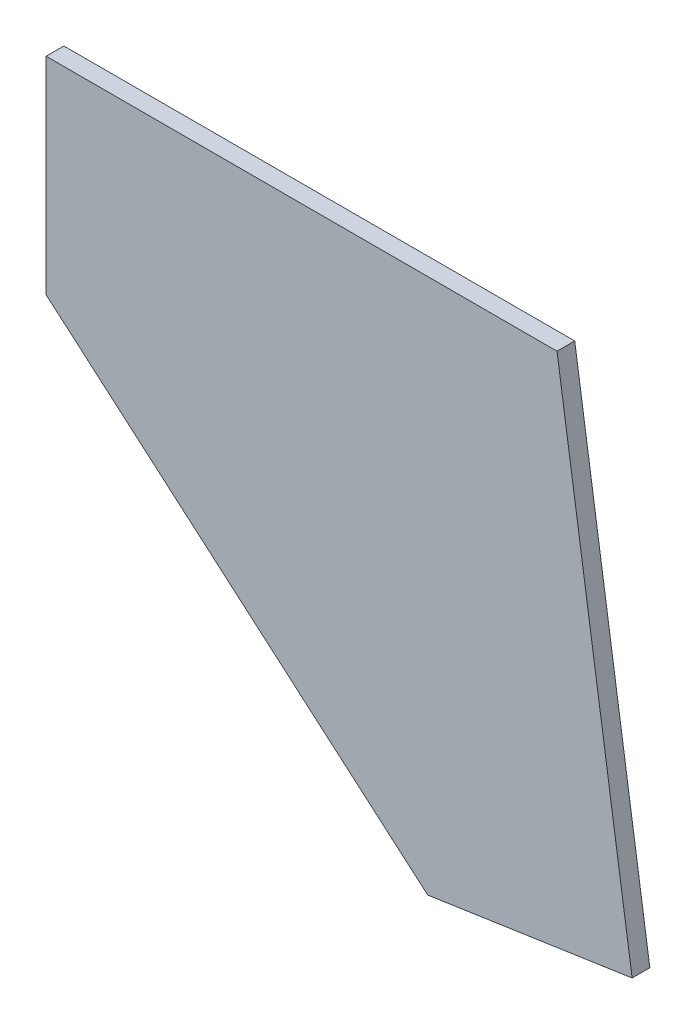
ISO-10303-21;
HEADER;
FILE_DESCRIPTION(('STEP AP214'),'2;1');
FILE_NAME('part.step','',(''),(''),'','','');
FILE_SCHEMA(('AUTOMOTIVE_DESIGN { 1 0 10303 214 1 1 1 1 }'));
ENDSEC;
DATA;
#1=APPLICATION_CONTEXT('core data for automotive mechanical design processes');
#2=APPLICATION_PROTOCOL_DEFINITION('international standard','automotive_design',2000,#1);
#3=PRODUCT_CONTEXT('',#1,'mechanical');
#4=PRODUCT('Part','Part','',(#3));
#5=PRODUCT_RELATED_PRODUCT_CATEGORY('part','',(#4));
#6=PRODUCT_DEFINITION_FORMATION('','',#4);
#7=PRODUCT_DEFINITION_CONTEXT('part definition',#1,'design');
#8=PRODUCT_DEFINITION('design','',#6,#7);
#9=PRODUCT_DEFINITION_SHAPE('','',#8);
#10=(LENGTH_UNIT() NAMED_UNIT(*) SI_UNIT(.MILLI.,.METRE.));
#11=(NAMED_UNIT(*) PLANE_ANGLE_UNIT() SI_UNIT($,.RADIAN.));
#12=(NAMED_UNIT(*) SI_UNIT($,.STERADIAN.) SOLID_ANGLE_UNIT());
#13=UNCERTAINTY_MEASURE_WITH_UNIT(LENGTH_MEASURE(1.E-05),#10,'distance_accuracy_value','');
#14=(GEOMETRIC_REPRESENTATION_CONTEXT(3) GLOBAL_UNCERTAINTY_ASSIGNED_CONTEXT((#13)) GLOBAL_UNIT_ASSIGNED_CONTEXT((#10,
#11,#12)) REPRESENTATION_CONTEXT('',''));
#15=CARTESIAN_POINT('',(0.,0.,0.));
#16=DIRECTION('',(0.,0.,1.));
#17=DIRECTION('',(1.,0.,0.));
#18=AXIS2_PLACEMENT_3D('',#15,#16,#17);
#19=CARTESIAN_POINT('',(-17.6726500668737,-221.169430364682,-6.));
#20=DIRECTION('',(0.989131438478668,0.147034000874357,0.));
#21=DIRECTION('',(-0.147034000874357,0.989131438478668,0.));
#22=AXIS2_PLACEMENT_3D('',#19,#20,#21);
#23=PLANE('',#22);
#24=DIRECTION('',(-0.147034000874357,0.989131438478668,0.));
#25=VECTOR('',#24,1.);
#26=CARTESIAN_POINT('',(-17.6726500668737,-221.169430364682,0.));
#27=LINE('',#26,#25);
#28=CARTESIAN_POINT('',(-17.6726500668737,-221.169430364682,0.));
#29=VERTEX_POINT('',#28);
#30=CARTESIAN_POINT('',(-43.1169188413177,-50.0000000000005,0.));
#31=VERTEX_POINT('',#30);
#32=EDGE_CURVE('E113',#29,#31,#27,.T.);
#33=ORIENTED_EDGE('',*,*,#32,.F.);
#34=DIRECTION('',(0.,0.,1.));
#35=VECTOR('',#34,1.);
#36=CARTESIAN_POINT('',(-17.6726500668737,-221.169430364682,-6.));
#37=LINE('',#36,#35);
#38=CARTESIAN_POINT('',(-17.6726500668737,-221.169430364682,-6.));
#39=VERTEX_POINT('',#38);
#40=EDGE_CURVE('E11',#39,#29,#37,.T.);
#41=ORIENTED_EDGE('',*,*,#40,.F.);
#42=DIRECTION('',(-0.147034000874357,0.989131438478668,0.));
#43=VECTOR('',#42,1.);
#44=CARTESIAN_POINT('',(-17.6726500668737,-221.169430364682,-6.));
#45=LINE('',#44,#43);
#46=CARTESIAN_POINT('',(-43.1169188413177,-50.0000000000005,-6.));
#47=VERTEX_POINT('',#46);
#48=EDGE_CURVE('E108',#39,#47,#45,.T.);
#49=ORIENTED_EDGE('',*,*,#48,.T.);
#50=DIRECTION('',(0.,0.,1.));
#51=VECTOR('',#50,1.);
#52=CARTESIAN_POINT('',(-43.1169188413177,-50.0000000000005,-6.));
#53=LINE('',#52,#51);
#54=EDGE_CURVE('E39',#47,#31,#53,.T.);
#55=ORIENTED_EDGE('',*,*,#54,.T.);
#56=EDGE_LOOP('',(#33,#41,#49,#55));
#57=FACE_BOUND('',#56,.T.);
#58=ADVANCED_FACE('F36',(#57),#23,.T.);
#59=CARTESIAN_POINT('',(-86.9118507603805,-231.461810425887,-6.));
#60=DIRECTION('',(0.147034000874357,-0.989131438478668,0.));
#61=DIRECTION('',(0.989131438478668,0.147034000874357,0.));
#62=AXIS2_PLACEMENT_3D('',#59,#60,#61);
#63=PLANE('',#62);
#64=DIRECTION('',(0.989131438478668,0.147034000874357,0.));
#65=VECTOR('',#64,1.);
#66=CARTESIAN_POINT('',(-86.9118507603805,-231.461810425887,0.));
#67=LINE('',#66,#65);
#68=CARTESIAN_POINT('',(-86.9118507603805,-231.461810425887,0.));
#69=VERTEX_POINT('',#68);
#70=EDGE_CURVE('E122',#69,#29,#67,.T.);
#71=ORIENTED_EDGE('',*,*,#70,.F.);
#72=DIRECTION('',(0.,0.,1.));
#73=VECTOR('',#72,1.);
#74=CARTESIAN_POINT('',(-86.9118507603805,-231.461810425887,-6.));
#75=LINE('',#74,#73);
#76=CARTESIAN_POINT('',(-86.9118507603805,-231.461810425887,-6.));
#77=VERTEX_POINT('',#76);
#78=EDGE_CURVE('E45',#77,#69,#75,.T.);
#79=ORIENTED_EDGE('',*,*,#78,.F.);
#80=DIRECTION('',(0.989131438478668,0.147034000874357,0.));
#81=VECTOR('',#80,1.);
#82=CARTESIAN_POINT('',(-86.9118507603805,-231.461810425887,-6.));
#83=LINE('',#82,#81);
#84=EDGE_CURVE('E103',#77,#39,#83,.T.);
#85=ORIENTED_EDGE('',*,*,#84,.T.);
#86=ORIENTED_EDGE('',*,*,#40,.T.);
#87=EDGE_LOOP('',(#71,#79,#85,#86));
#88=FACE_BOUND('',#87,.T.);
#89=ADVANCED_FACE('F128',(#88),#63,.T.);
#90=CARTESIAN_POINT('',(-216.167156358738,-120.000000000001,-6.));
#91=DIRECTION('',(-0.653056658769223,-0.757309052129432,0.));
#92=DIRECTION('',(0.757309052129432,-0.653056658769223,0.));
#93=AXIS2_PLACEMENT_3D('',#90,#91,#92);
#94=PLANE('',#93);
#95=DIRECTION('',(0.757309052129432,-0.653056658769223,0.));
#96=VECTOR('',#95,1.);
#97=CARTESIAN_POINT('',(-216.167156358738,-120.000000000001,0.));
#98=LINE('',#97,#96);
#99=CARTESIAN_POINT('',(-216.167156358738,-120.000000000001,0.));
#100=VERTEX_POINT('',#99);
#101=EDGE_CURVE('E92',#100,#69,#98,.T.);
#102=ORIENTED_EDGE('',*,*,#101,.F.);
#103=DIRECTION('',(0.,0.,1.));
#104=VECTOR('',#103,1.);
#105=CARTESIAN_POINT('',(-216.167156358738,-120.000000000001,-6.));
#106=LINE('',#105,#104);
#107=CARTESIAN_POINT('',(-216.167156358738,-120.000000000001,-6.));
#108=VERTEX_POINT('',#107);
#109=EDGE_CURVE('E87',#108,#100,#106,.T.);
#110=ORIENTED_EDGE('',*,*,#109,.F.);
#111=DIRECTION('',(0.757309052129432,-0.653056658769223,0.));
#112=VECTOR('',#111,1.);
#113=CARTESIAN_POINT('',(-216.167156358738,-120.000000000001,-6.));
#114=LINE('',#113,#112);
#115=EDGE_CURVE('E90',#108,#77,#114,.T.);
#116=ORIENTED_EDGE('',*,*,#115,.T.);
#117=ORIENTED_EDGE('',*,*,#78,.T.);
#118=EDGE_LOOP('',(#102,#110,#116,#117));
#119=FACE_BOUND('',#118,.T.);
#120=ADVANCED_FACE('F89',(#119),#94,.T.);
#121=CARTESIAN_POINT('',(-216.167156358738,-50.0000000000006,-6.));
#122=DIRECTION('',(-1.,0.,0.));
#123=DIRECTION('',(0.,0.,1.));
#124=AXIS2_PLACEMENT_3D('',#121,#122,#123);
#125=PLANE('',#124);
#126=DIRECTION('',(0.,-1.,0.));
#127=VECTOR('',#126,1.);
#128=CARTESIAN_POINT('',(-216.167156358738,-50.0000000000006,0.));
#129=LINE('',#128,#127);
#130=CARTESIAN_POINT('',(-216.167156358738,-50.0000000000006,0.));
#131=VERTEX_POINT('',#130);
#132=EDGE_CURVE('E119',#131,#100,#129,.T.);
#133=ORIENTED_EDGE('',*,*,#132,.F.);
#134=DIRECTION('',(0.,0.,1.));
#135=VECTOR('',#134,1.);
#136=CARTESIAN_POINT('',(-216.167156358738,-50.0000000000006,-6.));
#137=LINE('',#136,#135);
#138=CARTESIAN_POINT('',(-216.167156358738,-50.0000000000006,-6.));
#139=VERTEX_POINT('',#138);
#140=EDGE_CURVE('E97',#139,#131,#137,.T.);
#141=ORIENTED_EDGE('',*,*,#140,.F.);
#142=DIRECTION('',(0.,-1.,0.));
#143=VECTOR('',#142,1.);
#144=CARTESIAN_POINT('',(-216.167156358738,-50.0000000000006,-6.));
#145=LINE('',#144,#143);
#146=EDGE_CURVE('E102',#139,#108,#145,.T.);
#147=ORIENTED_EDGE('',*,*,#146,.T.);
#148=ORIENTED_EDGE('',*,*,#109,.T.);
#149=EDGE_LOOP('',(#133,#141,#147,#148));
#150=FACE_BOUND('',#149,.T.);
#151=ADVANCED_FACE('F105',(#150),#125,.T.);
#152=CARTESIAN_POINT('',(-43.1169188413177,-50.0000000000005,-6.));
#153=DIRECTION('',(0.,1.,0.));
#154=DIRECTION('',(-1.,0.,0.));
#155=AXIS2_PLACEMENT_3D('',#152,#153,#154);
#156=PLANE('',#155);
#157=DIRECTION('',(-1.,0.,0.));
#158=VECTOR('',#157,1.);
#159=CARTESIAN_POINT('',(-43.1169188413177,-50.0000000000005,0.));
#160=LINE('',#159,#158);
#161=EDGE_CURVE('E116',#31,#131,#160,.T.);
#162=ORIENTED_EDGE('',*,*,#161,.F.);
#163=ORIENTED_EDGE('',*,*,#54,.F.);
#164=DIRECTION('',(-1.,0.,0.));
#165=VECTOR('',#164,1.);
#166=CARTESIAN_POINT('',(-43.1169188413177,-50.0000000000005,-6.));
#167=LINE('',#166,#165);
#168=EDGE_CURVE('E106',#47,#139,#167,.T.);
#169=ORIENTED_EDGE('',*,*,#168,.T.);
#170=ORIENTED_EDGE('',*,*,#140,.T.);
#171=EDGE_LOOP('',(#162,#163,#169,#170));
#172=FACE_BOUND('',#171,.T.);
#173=ADVANCED_FACE('F125',(#172),#156,.T.);
#174=CARTESIAN_POINT('',(0.,0.,-6.));
#175=DIRECTION('',(0.,0.,-1.));
#176=DIRECTION('',(-1.,0.,0.));
#177=AXIS2_PLACEMENT_3D('',#174,#175,#176);
#178=PLANE('',#177);
#179=ORIENTED_EDGE('',*,*,#48,.F.);
#180=ORIENTED_EDGE('',*,*,#84,.F.);
#181=ORIENTED_EDGE('',*,*,#115,.F.);
#182=ORIENTED_EDGE('',*,*,#146,.F.);
#183=ORIENTED_EDGE('',*,*,#168,.F.);
#184=EDGE_LOOP('',(#179,#180,#181,#182,#183));
#185=FACE_BOUND('',#184,.T.);
#186=ADVANCED_FACE('F101',(#185),#178,.T.);
#187=CARTESIAN_POINT('',(0.,0.,0.));
#188=DIRECTION('',(0.,0.,-1.));
#189=DIRECTION('',(-1.,0.,0.));
#190=AXIS2_PLACEMENT_3D('',#187,#188,#189);
#191=PLANE('',#190);
#192=ORIENTED_EDGE('',*,*,#32,.T.);
#193=ORIENTED_EDGE('',*,*,#161,.T.);
#194=ORIENTED_EDGE('',*,*,#132,.T.);
#195=ORIENTED_EDGE('',*,*,#101,.T.);
#196=ORIENTED_EDGE('',*,*,#70,.T.);
#197=EDGE_LOOP('',(#192,#193,#194,#195,#196));
#198=FACE_BOUND('',#197,.T.);
#199=ADVANCED_FACE('F127',(#198),#191,.F.);
#200=CLOSED_SHELL('',(#58,#89,#120,#151,#173,#186,#199));
#201=MANIFOLD_SOLID_BREP('B2',#200);
#202=ADVANCED_BREP_SHAPE_REPRESENTATION('',(#18,#201),#14);
#203=SHAPE_DEFINITION_REPRESENTATION(#9,#202);
ENDSEC;
END-ISO-10303-21;
